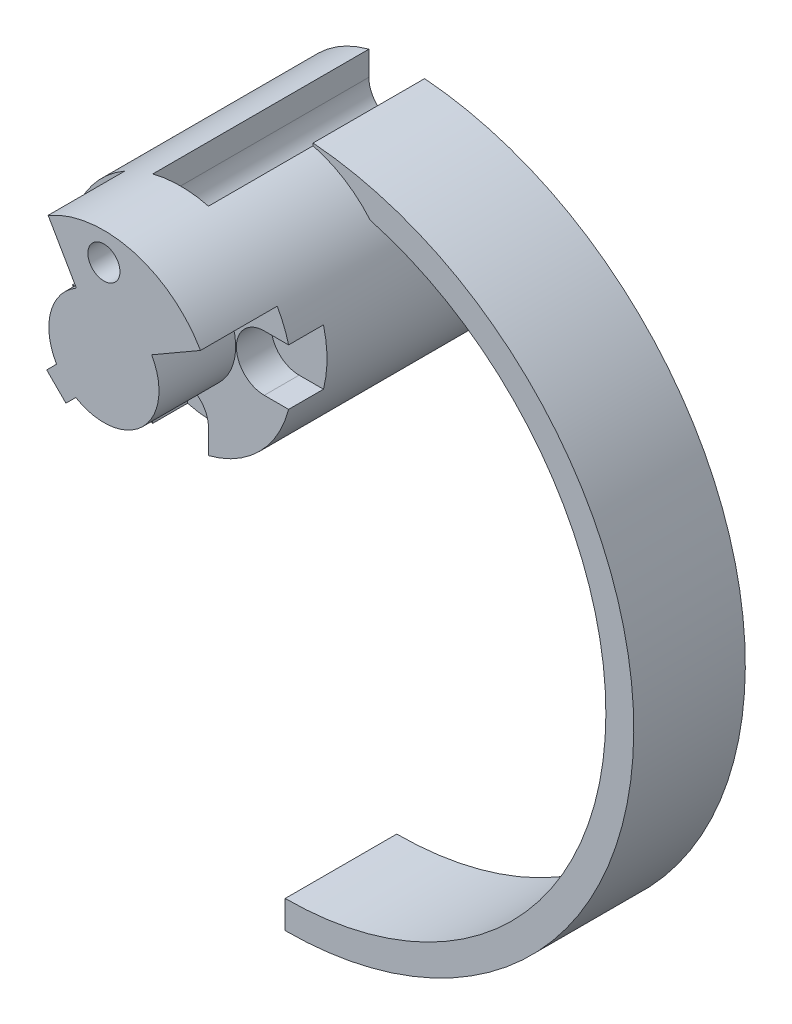
ISO-10303-21;
HEADER;
FILE_DESCRIPTION(('STEP AP214'),'2;1');
FILE_NAME('part.step','',(''),(''),'','','');
FILE_SCHEMA(('AUTOMOTIVE_DESIGN { 1 0 10303 214 1 1 1 1 }'));
ENDSEC;
DATA;
#1=APPLICATION_CONTEXT('core data for automotive mechanical design processes');
#2=APPLICATION_PROTOCOL_DEFINITION('international standard','automotive_design',2000,#1);
#3=PRODUCT_CONTEXT('',#1,'mechanical');
#4=PRODUCT('Part','Part','',(#3));
#5=PRODUCT_RELATED_PRODUCT_CATEGORY('part','',(#4));
#6=PRODUCT_DEFINITION_FORMATION('','',#4);
#7=PRODUCT_DEFINITION_CONTEXT('part definition',#1,'design');
#8=PRODUCT_DEFINITION('design','',#6,#7);
#9=PRODUCT_DEFINITION_SHAPE('','',#8);
#10=(LENGTH_UNIT() NAMED_UNIT(*) SI_UNIT(.MILLI.,.METRE.));
#11=(NAMED_UNIT(*) PLANE_ANGLE_UNIT() SI_UNIT($,.RADIAN.));
#12=(NAMED_UNIT(*) SI_UNIT($,.STERADIAN.) SOLID_ANGLE_UNIT());
#13=UNCERTAINTY_MEASURE_WITH_UNIT(LENGTH_MEASURE(1.E-05),#10,'distance_accuracy_value','');
#14=(GEOMETRIC_REPRESENTATION_CONTEXT(3) GLOBAL_UNCERTAINTY_ASSIGNED_CONTEXT((#13)) GLOBAL_UNIT_ASSIGNED_CONTEXT((#10,
#11,#12)) REPRESENTATION_CONTEXT('',''));
#15=CARTESIAN_POINT('',(0.,0.,0.));
#16=DIRECTION('',(0.,0.,1.));
#17=DIRECTION('',(1.,0.,0.));
#18=AXIS2_PLACEMENT_3D('',#15,#16,#17);
#19=CARTESIAN_POINT('',(0.,-17.,-8.));
#20=DIRECTION('',(0.,0.,1.));
#21=DIRECTION('',(-1.,0.,0.));
#22=AXIS2_PLACEMENT_3D('',#19,#20,#21);
#23=PLANE('',#22);
#24=CARTESIAN_POINT('',(0.,0.,-8.));
#25=DIRECTION('',(0.,0.,1.));
#26=DIRECTION('',(1.,0.,0.));
#27=AXIS2_PLACEMENT_3D('',#24,#25,#26);
#28=CIRCLE('',#27,8.);
#29=CARTESIAN_POINT('',(-2.,7.74596669241485,-8.));
#30=VERTEX_POINT('',#29);
#31=CARTESIAN_POINT('',(6.09952065732505,5.17647058823529,-8.));
#32=VERTEX_POINT('',#31);
#33=EDGE_CURVE('E360',#30,#32,#28,.T.);
#34=ORIENTED_EDGE('',*,*,#33,.F.);
#35=DIRECTION('',(0.,-1.,0.));
#36=VECTOR('',#35,1.);
#37=CARTESIAN_POINT('',(-2.,6.,-8.));
#38=LINE('',#37,#36);
#39=CARTESIAN_POINT('',(-2.,6.,-8.));
#40=VERTEX_POINT('',#39);
#41=EDGE_CURVE('E282',#30,#40,#38,.T.);
#42=ORIENTED_EDGE('',*,*,#41,.T.);
#43=CARTESIAN_POINT('',(0.,6.,-8.));
#44=DIRECTION('',(0.,0.,1.));
#45=DIRECTION('',(-1.,0.,0.));
#46=AXIS2_PLACEMENT_3D('',#43,#44,#45);
#47=CIRCLE('',#46,2.);
#48=CARTESIAN_POINT('',(2.,6.,-8.));
#49=VERTEX_POINT('',#48);
#50=EDGE_CURVE('E289',#40,#49,#47,.T.);
#51=ORIENTED_EDGE('',*,*,#50,.T.);
#52=DIRECTION('',(0.,1.,0.));
#53=VECTOR('',#52,1.);
#54=CARTESIAN_POINT('',(2.,10.,-8.));
#55=LINE('',#54,#53);
#56=CARTESIAN_POINT('',(2.,7.91987158875422,-8.));
#57=VERTEX_POINT('',#56);
#58=EDGE_CURVE('E286',#49,#57,#55,.T.);
#59=ORIENTED_EDGE('',*,*,#58,.T.);
#60=CARTESIAN_POINT('',(0.,-17.,-8.));
#61=DIRECTION('',(0.,0.,1.));
#62=DIRECTION('',(-1.,0.,0.));
#63=AXIS2_PLACEMENT_3D('',#60,#61,#62);
#64=CIRCLE('',#63,25.);
#65=CARTESIAN_POINT('',(0.,-42.,-8.));
#66=VERTEX_POINT('',#65);
#67=EDGE_CURVE('E357',#66,#57,#64,.T.);
#68=ORIENTED_EDGE('',*,*,#67,.F.);
#69=DIRECTION('',(0.,-1.,0.));
#70=VECTOR('',#69,1.);
#71=CARTESIAN_POINT('',(0.,-42.,-8.));
#72=LINE('',#71,#70);
#73=CARTESIAN_POINT('',(0.,-40.,-8.));
#74=VERTEX_POINT('',#73);
#75=EDGE_CURVE('E367',#74,#66,#72,.T.);
#76=ORIENTED_EDGE('',*,*,#75,.F.);
#77=CARTESIAN_POINT('',(0.,-17.,-8.));
#78=DIRECTION('',(0.,0.,-1.));
#79=DIRECTION('',(-1.,0.,0.));
#80=AXIS2_PLACEMENT_3D('',#77,#78,#79);
#81=CIRCLE('',#80,23.);
#82=EDGE_CURVE('E364',#32,#74,#81,.T.);
#83=ORIENTED_EDGE('',*,*,#82,.F.);
#84=EDGE_LOOP('',(#34,#42,#51,#59,#68,#76,#83));
#85=FACE_BOUND('',#84,.T.);
#86=ADVANCED_FACE('F35',(#85),#23,.F.);
#87=CARTESIAN_POINT('',(0.,-17.,0.));
#88=DIRECTION('',(0.,0.,1.));
#89=DIRECTION('',(-1.,0.,0.));
#90=AXIS2_PLACEMENT_3D('',#87,#88,#89);
#91=PLANE('',#90);
#92=DIRECTION('',(0.,-1.,0.));
#93=VECTOR('',#92,1.);
#94=CARTESIAN_POINT('',(2.,-17.,0.));
#95=LINE('',#94,#93);
#96=CARTESIAN_POINT('',(2.,7.91987158875422,0.));
#97=VERTEX_POINT('',#96);
#98=CARTESIAN_POINT('',(2.,7.74596669241484,0.));
#99=VERTEX_POINT('',#98);
#100=EDGE_CURVE('E343',#97,#99,#95,.T.);
#101=ORIENTED_EDGE('',*,*,#100,.T.);
#102=CARTESIAN_POINT('',(0.,0.,0.));
#103=DIRECTION('',(0.,0.,-1.));
#104=DIRECTION('',(-1.,0.,0.));
#105=AXIS2_PLACEMENT_3D('',#102,#103,#104);
#106=CIRCLE('',#105,8.);
#107=CARTESIAN_POINT('',(6.09952065732505,5.17647058823529,0.));
#108=VERTEX_POINT('',#107);
#109=EDGE_CURVE('E351',#99,#108,#106,.T.);
#110=ORIENTED_EDGE('',*,*,#109,.T.);
#111=CARTESIAN_POINT('',(0.,-17.,0.));
#112=DIRECTION('',(0.,0.,-1.));
#113=DIRECTION('',(-1.,0.,0.));
#114=AXIS2_PLACEMENT_3D('',#111,#112,#113);
#115=CIRCLE('',#114,23.);
#116=CARTESIAN_POINT('',(0.,-40.,0.));
#117=VERTEX_POINT('',#116);
#118=EDGE_CURVE('E373',#108,#117,#115,.T.);
#119=ORIENTED_EDGE('',*,*,#118,.T.);
#120=DIRECTION('',(0.,-1.,0.));
#121=VECTOR('',#120,1.);
#122=CARTESIAN_POINT('',(0.,-42.,0.));
#123=LINE('',#122,#121);
#124=CARTESIAN_POINT('',(0.,-42.,0.));
#125=VERTEX_POINT('',#124);
#126=EDGE_CURVE('E361',#117,#125,#123,.T.);
#127=ORIENTED_EDGE('',*,*,#126,.T.);
#128=CARTESIAN_POINT('',(0.,-17.,0.));
#129=DIRECTION('',(0.,0.,1.));
#130=DIRECTION('',(-1.,0.,0.));
#131=AXIS2_PLACEMENT_3D('',#128,#129,#130);
#132=CIRCLE('',#131,25.);
#133=EDGE_CURVE('E354',#125,#97,#132,.T.);
#134=ORIENTED_EDGE('',*,*,#133,.T.);
#135=EDGE_LOOP('',(#101,#110,#119,#127,#134));
#136=FACE_BOUND('',#135,.T.);
#137=ADVANCED_FACE('F415',(#136),#91,.T.);
#138=CARTESIAN_POINT('',(0.,-17.,-8.));
#139=DIRECTION('',(0.,0.,1.));
#140=DIRECTION('',(-1.,0.,0.));
#141=AXIS2_PLACEMENT_3D('',#138,#139,#140);
#142=CYLINDRICAL_SURFACE('',#141,25.);
#143=ORIENTED_EDGE('',*,*,#133,.F.);
#144=DIRECTION('',(0.,0.,1.));
#145=VECTOR('',#144,1.);
#146=CARTESIAN_POINT('',(0.,-42.,-8.));
#147=LINE('',#146,#145);
#148=EDGE_CURVE('E370',#66,#125,#147,.T.);
#149=ORIENTED_EDGE('',*,*,#148,.F.);
#150=ORIENTED_EDGE('',*,*,#67,.T.);
#151=DIRECTION('',(0.,0.,1.));
#152=VECTOR('',#151,1.);
#153=CARTESIAN_POINT('',(2.,7.91987158875422,-8.));
#154=LINE('',#153,#152);
#155=EDGE_CURVE('E346',#97,#57,#154,.F.);
#156=ORIENTED_EDGE('',*,*,#155,.F.);
#157=EDGE_LOOP('',(#143,#149,#150,#156));
#158=FACE_BOUND('',#157,.T.);
#159=ADVANCED_FACE('F37',(#158),#142,.T.);
#160=CARTESIAN_POINT('',(0.,0.,-8.));
#161=DIRECTION('',(0.,0.,1.));
#162=DIRECTION('',(-1.,0.,0.));
#163=AXIS2_PLACEMENT_3D('',#160,#161,#162);
#164=CYLINDRICAL_SURFACE('',#163,8.);
#165=CARTESIAN_POINT('',(0.,0.,5.));
#166=DIRECTION('',(0.,0.,-1.));
#167=DIRECTION('',(-1.,0.,0.));
#168=AXIS2_PLACEMENT_3D('',#165,#166,#167);
#169=CIRCLE('',#168,8.00000000000001);
#170=CARTESIAN_POINT('',(7.74596669241483,-2.,5.));
#171=VERTEX_POINT('',#170);
#172=CARTESIAN_POINT('',(7.74596669241483,2.,5.));
#173=VERTEX_POINT('',#172);
#174=EDGE_CURVE('E561',#171,#173,#169,.F.);
#175=ORIENTED_EDGE('',*,*,#174,.F.);
#176=DIRECTION('',(0.,0.,1.));
#177=VECTOR('',#176,1.);
#178=CARTESIAN_POINT('',(7.74596669241483,-2.,-8.));
#179=LINE('',#178,#177);
#180=CARTESIAN_POINT('',(7.74596669241483,-2.,7.5));
#181=VERTEX_POINT('',#180);
#182=EDGE_CURVE('E387',#181,#171,#179,.F.);
#183=ORIENTED_EDGE('',*,*,#182,.F.);
#184=CARTESIAN_POINT('',(0.,0.,7.5));
#185=DIRECTION('',(0.,0.,-1.));
#186=DIRECTION('',(-1.,0.,0.));
#187=AXIS2_PLACEMENT_3D('',#184,#185,#186);
#188=CIRCLE('',#187,8.);
#189=CARTESIAN_POINT('',(2.,-7.74596669241483,7.5));
#190=VERTEX_POINT('',#189);
#191=EDGE_CURVE('E609',#190,#181,#188,.F.);
#192=ORIENTED_EDGE('',*,*,#191,.F.);
#193=DIRECTION('',(0.,0.,1.));
#194=VECTOR('',#193,1.);
#195=CARTESIAN_POINT('',(2.,-7.74596669241483,-8.));
#196=LINE('',#195,#194);
#197=CARTESIAN_POINT('',(2.,-7.74596669241483,5.));
#198=VERTEX_POINT('',#197);
#199=EDGE_CURVE('E389',#198,#190,#196,.T.);
#200=ORIENTED_EDGE('',*,*,#199,.F.);
#201=CARTESIAN_POINT('',(-2.,-7.74596669241484,5.));
#202=VERTEX_POINT('',#201);
#203=EDGE_CURVE('E559',#202,#198,#169,.F.);
#204=ORIENTED_EDGE('',*,*,#203,.F.);
#205=DIRECTION('',(0.,0.,1.));
#206=VECTOR('',#205,1.);
#207=CARTESIAN_POINT('',(-2.,-7.74596669241484,-8.));
#208=LINE('',#207,#206);
#209=CARTESIAN_POINT('',(-2.,-7.74596669241483,7.5));
#210=VERTEX_POINT('',#209);
#211=EDGE_CURVE('E392',#210,#202,#208,.F.);
#212=ORIENTED_EDGE('',*,*,#211,.F.);
#213=CARTESIAN_POINT('',(-7.74596669241483,-2.,7.5));
#214=VERTEX_POINT('',#213);
#215=EDGE_CURVE('E583',#214,#210,#188,.F.);
#216=ORIENTED_EDGE('',*,*,#215,.F.);
#217=DIRECTION('',(0.,0.,1.));
#218=VECTOR('',#217,1.);
#219=CARTESIAN_POINT('',(-7.74596669241484,-2.,-8.));
#220=LINE('',#219,#218);
#221=CARTESIAN_POINT('',(-7.74596669241484,-2.,5.));
#222=VERTEX_POINT('',#221);
#223=EDGE_CURVE('E395',#222,#214,#220,.T.);
#224=ORIENTED_EDGE('',*,*,#223,.F.);
#225=CARTESIAN_POINT('',(-7.74596669241485,2.,5.));
#226=VERTEX_POINT('',#225);
#227=EDGE_CURVE('E546',#226,#222,#169,.F.);
#228=ORIENTED_EDGE('',*,*,#227,.F.);
#229=DIRECTION('',(0.,0.,1.));
#230=VECTOR('',#229,1.);
#231=CARTESIAN_POINT('',(-7.74596669241485,2.,-8.));
#232=LINE('',#231,#230);
#233=CARTESIAN_POINT('',(-7.74596669241483,2.,7.5));
#234=VERTEX_POINT('',#233);
#235=EDGE_CURVE('E398',#234,#226,#232,.F.);
#236=ORIENTED_EDGE('',*,*,#235,.F.);
#237=CARTESIAN_POINT('',(-4.00000000000001,6.92820323027551,7.5));
#238=VERTEX_POINT('',#237);
#239=EDGE_CURVE('E580',#238,#234,#188,.F.);
#240=ORIENTED_EDGE('',*,*,#239,.F.);
#241=DIRECTION('',(0.,0.,1.));
#242=VECTOR('',#241,1.);
#243=CARTESIAN_POINT('',(-4.00000000000001,6.92820323027551,-14.3826701223687));
#244=LINE('',#243,#242);
#245=CARTESIAN_POINT('',(-4.00000000000001,6.92820323027551,13.));
#246=VERTEX_POINT('',#245);
#247=EDGE_CURVE('E275',#238,#246,#244,.T.);
#248=ORIENTED_EDGE('',*,*,#247,.T.);
#249=CARTESIAN_POINT('',(0.,0.,13.));
#250=DIRECTION('',(0.,0.,-1.));
#251=DIRECTION('',(-1.,0.,0.));
#252=AXIS2_PLACEMENT_3D('',#249,#250,#251);
#253=CIRCLE('',#252,8.);
#254=CARTESIAN_POINT('',(6.92820323027549,4.00000000000003,13.));
#255=VERTEX_POINT('',#254);
#256=EDGE_CURVE('E352',#246,#255,#253,.T.);
#257=ORIENTED_EDGE('',*,*,#256,.T.);
#258=DIRECTION('',(0.,0.,1.));
#259=VECTOR('',#258,1.);
#260=CARTESIAN_POINT('',(6.92820323027549,4.00000000000003,-14.3826701223687));
#261=LINE('',#260,#259);
#262=CARTESIAN_POINT('',(6.92820323027549,4.00000000000003,7.5));
#263=VERTEX_POINT('',#262);
#264=EDGE_CURVE('E232',#263,#255,#261,.T.);
#265=ORIENTED_EDGE('',*,*,#264,.F.);
#266=CARTESIAN_POINT('',(7.74596669241483,2.,7.5));
#267=VERTEX_POINT('',#266);
#268=EDGE_CURVE('E266',#267,#263,#188,.F.);
#269=ORIENTED_EDGE('',*,*,#268,.F.);
#270=DIRECTION('',(0.,0.,1.));
#271=VECTOR('',#270,1.);
#272=CARTESIAN_POINT('',(7.74596669241483,2.,-8.));
#273=LINE('',#272,#271);
#274=EDGE_CURVE('E383',#173,#267,#273,.T.);
#275=ORIENTED_EDGE('',*,*,#274,.F.);
#276=EDGE_LOOP('',(#175,#183,#192,#200,#204,#212,#216,#224,#228,#236,#240,#248,#257,#265,#269,#275));
#277=FACE_BOUND('',#276,.T.);
#278=ORIENTED_EDGE('',*,*,#109,.F.);
#279=DIRECTION('',(0.,0.,1.));
#280=VECTOR('',#279,1.);
#281=CARTESIAN_POINT('',(2.,7.74596669241484,-8.));
#282=LINE('',#281,#280);
#283=CARTESIAN_POINT('',(2.,7.74596669241484,7.5));
#284=VERTEX_POINT('',#283);
#285=EDGE_CURVE('E43',#284,#99,#282,.F.);
#286=ORIENTED_EDGE('',*,*,#285,.F.);
#287=CARTESIAN_POINT('',(0.,0.,7.5));
#288=DIRECTION('',(0.,0.,-1.));
#289=DIRECTION('',(-1.,0.,0.));
#290=AXIS2_PLACEMENT_3D('',#287,#288,#289);
#291=CIRCLE('',#290,8.);
#292=CARTESIAN_POINT('',(-2.,7.74596669241485,7.5));
#293=VERTEX_POINT('',#292);
#294=EDGE_CURVE('E340',#293,#284,#291,.T.);
#295=ORIENTED_EDGE('',*,*,#294,.F.);
#296=DIRECTION('',(0.,0.,1.));
#297=VECTOR('',#296,1.);
#298=CARTESIAN_POINT('',(-2.,7.74596669241485,-8.));
#299=LINE('',#298,#297);
#300=EDGE_CURVE('E401',#30,#293,#299,.T.);
#301=ORIENTED_EDGE('',*,*,#300,.F.);
#302=ORIENTED_EDGE('',*,*,#33,.T.);
#303=DIRECTION('',(0.,0.,1.));
#304=VECTOR('',#303,1.);
#305=CARTESIAN_POINT('',(6.09952065732505,5.17647058823529,-8.));
#306=LINE('',#305,#304);
#307=EDGE_CURVE('E381',#32,#108,#306,.T.);
#308=ORIENTED_EDGE('',*,*,#307,.T.);
#309=EDGE_LOOP('',(#278,#286,#295,#301,#302,#308));
#310=FACE_BOUND('',#309,.T.);
#311=ADVANCED_FACE('F412',(#277,#310),#164,.T.);
#312=CARTESIAN_POINT('',(0.,-17.,-8.));
#313=DIRECTION('',(0.,0.,1.));
#314=DIRECTION('',(-1.,0.,0.));
#315=AXIS2_PLACEMENT_3D('',#312,#313,#314);
#316=CYLINDRICAL_SURFACE('',#315,23.);
#317=ORIENTED_EDGE('',*,*,#118,.F.);
#318=ORIENTED_EDGE('',*,*,#307,.F.);
#319=ORIENTED_EDGE('',*,*,#82,.T.);
#320=DIRECTION('',(0.,0.,1.));
#321=VECTOR('',#320,1.);
#322=CARTESIAN_POINT('',(0.,-40.,-8.));
#323=LINE('',#322,#321);
#324=EDGE_CURVE('E379',#74,#117,#323,.T.);
#325=ORIENTED_EDGE('',*,*,#324,.T.);
#326=EDGE_LOOP('',(#317,#318,#319,#325));
#327=FACE_BOUND('',#326,.T.);
#328=ADVANCED_FACE('F435',(#327),#316,.F.);
#329=CARTESIAN_POINT('',(0.,-42.,-8.));
#330=DIRECTION('',(1.,0.,0.));
#331=DIRECTION('',(0.,0.,1.));
#332=AXIS2_PLACEMENT_3D('',#329,#330,#331);
#333=PLANE('',#332);
#334=ORIENTED_EDGE('',*,*,#126,.F.);
#335=ORIENTED_EDGE('',*,*,#324,.F.);
#336=ORIENTED_EDGE('',*,*,#75,.T.);
#337=ORIENTED_EDGE('',*,*,#148,.T.);
#338=EDGE_LOOP('',(#334,#335,#336,#337));
#339=FACE_BOUND('',#338,.T.);
#340=ADVANCED_FACE('F437',(#339),#333,.F.);
#341=CARTESIAN_POINT('',(0.,6.,-8.));
#342=DIRECTION('',(0.,0.,1.));
#343=DIRECTION('',(-1.,0.,0.));
#344=AXIS2_PLACEMENT_3D('',#341,#342,#343);
#345=CYLINDRICAL_SURFACE('',#344,1.15);
#346=CARTESIAN_POINT('',(0.,6.,7.5));
#347=DIRECTION('',(0.,0.,-1.));
#348=DIRECTION('',(-1.,0.,0.));
#349=AXIS2_PLACEMENT_3D('',#346,#347,#348);
#350=CIRCLE('',#349,1.15);
#351=CARTESIAN_POINT('',(-1.15,6.,7.5));
#352=VERTEX_POINT('',#351);
#353=EDGE_CURVE('E303',#352,#352,#350,.T.);
#354=ORIENTED_EDGE('',*,*,#353,.T.);
#355=EDGE_LOOP('',(#354));
#356=FACE_BOUND('',#355,.T.);
#357=CARTESIAN_POINT('',(0.,6.,13.));
#358=DIRECTION('',(0.,0.,-1.));
#359=DIRECTION('',(-1.,0.,0.));
#360=AXIS2_PLACEMENT_3D('',#357,#358,#359);
#361=CIRCLE('',#360,1.15);
#362=CARTESIAN_POINT('',(-1.15,6.,13.));
#363=VERTEX_POINT('',#362);
#364=EDGE_CURVE('E348',#363,#363,#361,.T.);
#365=ORIENTED_EDGE('',*,*,#364,.F.);
#366=EDGE_LOOP('',(#365));
#367=FACE_BOUND('',#366,.T.);
#368=ADVANCED_FACE('F439',(#356,#367),#345,.F.);
#369=CARTESIAN_POINT('',(0.,0.,13.));
#370=DIRECTION('',(0.,0.,1.));
#371=DIRECTION('',(-1.,0.,0.));
#372=AXIS2_PLACEMENT_3D('',#369,#370,#371);
#373=PLANE('',#372);
#374=DIRECTION('',(0.500000000000001,-0.866025403784438,0.));
#375=VECTOR('',#374,1.);
#376=CARTESIAN_POINT('',(-4.00000000000001,6.92820323027551,13.));
#377=LINE('',#376,#375);
#378=CARTESIAN_POINT('',(-1.975,3.42080034494853,13.));
#379=VERTEX_POINT('',#378);
#380=EDGE_CURVE('E242',#246,#379,#377,.T.);
#381=ORIENTED_EDGE('',*,*,#380,.T.);
#382=CARTESIAN_POINT('',(0.,0.,13.));
#383=DIRECTION('',(0.,0.,1.));
#384=DIRECTION('',(-1.,0.,0.));
#385=AXIS2_PLACEMENT_3D('',#382,#383,#384);
#386=CIRCLE('',#385,3.95);
#387=CARTESIAN_POINT('',(-3.39607602250434,-2.01721779919054,13.));
#388=VERTEX_POINT('',#387);
#389=EDGE_CURVE('E255',#379,#388,#386,.T.);
#390=ORIENTED_EDGE('',*,*,#389,.T.);
#391=DIRECTION('',(-0.707106781186551,-0.707106781186544,0.));
#392=VECTOR('',#391,1.);
#393=CARTESIAN_POINT('',(-4.10318280369089,-2.72432458037708,13.));
#394=LINE('',#393,#392);
#395=CARTESIAN_POINT('',(-4.10318280369089,-2.72432458037708,13.));
#396=VERTEX_POINT('',#395);
#397=EDGE_CURVE('E258',#388,#396,#394,.T.);
#398=ORIENTED_EDGE('',*,*,#397,.T.);
#399=DIRECTION('',(0.707106781186544,-0.707106781186551,0.));
#400=VECTOR('',#399,1.);
#401=CARTESIAN_POINT('',(-2.72432458037713,-4.10318280369086,13.));
#402=LINE('',#401,#400);
#403=CARTESIAN_POINT('',(-2.72432458037713,-4.10318280369086,13.));
#404=VERTEX_POINT('',#403);
#405=EDGE_CURVE('E261',#396,#404,#402,.T.);
#406=ORIENTED_EDGE('',*,*,#405,.T.);
#407=DIRECTION('',(0.707106781186552,0.707106781186543,0.));
#408=VECTOR('',#407,1.);
#409=CARTESIAN_POINT('',(-2.01721779919058,-3.39607602250432,13.));
#410=LINE('',#409,#408);
#411=CARTESIAN_POINT('',(-2.01721779919058,-3.39607602250432,13.));
#412=VERTEX_POINT('',#411);
#413=EDGE_CURVE('E233',#404,#412,#410,.T.);
#414=ORIENTED_EDGE('',*,*,#413,.T.);
#415=CARTESIAN_POINT('',(0.,0.,13.));
#416=DIRECTION('',(0.,0.,1.));
#417=DIRECTION('',(-1.,0.,0.));
#418=AXIS2_PLACEMENT_3D('',#415,#416,#417);
#419=CIRCLE('',#418,3.95);
#420=CARTESIAN_POINT('',(3.42080034494852,1.97500000000002,13.));
#421=VERTEX_POINT('',#420);
#422=EDGE_CURVE('E226',#412,#421,#419,.T.);
#423=ORIENTED_EDGE('',*,*,#422,.T.);
#424=DIRECTION('',(0.866025403784436,0.500000000000004,0.));
#425=VECTOR('',#424,1.);
#426=CARTESIAN_POINT('',(3.42080034494852,1.97500000000002,13.));
#427=LINE('',#426,#425);
#428=EDGE_CURVE('E236',#421,#255,#427,.T.);
#429=ORIENTED_EDGE('',*,*,#428,.T.);
#430=ORIENTED_EDGE('',*,*,#256,.F.);
#431=EDGE_LOOP('',(#381,#390,#398,#406,#414,#423,#429,#430));
#432=FACE_BOUND('',#431,.T.);
#433=ORIENTED_EDGE('',*,*,#364,.T.);
#434=EDGE_LOOP('',(#433));
#435=FACE_BOUND('',#434,.T.);
#436=ADVANCED_FACE('F245',(#432,#435),#373,.T.);
#437=CARTESIAN_POINT('',(10.,-2.,20.211102550928));
#438=DIRECTION('',(0.,-1.,0.));
#439=DIRECTION('',(1.,0.,0.));
#440=AXIS2_PLACEMENT_3D('',#437,#438,#439);
#441=PLANE('',#440);
#442=DIRECTION('',(0.,0.,-1.));
#443=VECTOR('',#442,1.);
#444=CARTESIAN_POINT('',(6.,-2.,20.211102550928));
#445=LINE('',#444,#443);
#446=CARTESIAN_POINT('',(6.,-2.,7.5));
#447=VERTEX_POINT('',#446);
#448=CARTESIAN_POINT('',(6.,-2.,5.));
#449=VERTEX_POINT('',#448);
#450=EDGE_CURVE('E320',#447,#449,#445,.T.);
#451=ORIENTED_EDGE('',*,*,#450,.F.);
#452=DIRECTION('',(1.,0.,0.));
#453=VECTOR('',#452,1.);
#454=CARTESIAN_POINT('',(10.,-2.,7.5));
#455=LINE('',#454,#453);
#456=EDGE_CURVE('E281',#447,#181,#455,.T.);
#457=ORIENTED_EDGE('',*,*,#456,.T.);
#458=ORIENTED_EDGE('',*,*,#182,.T.);
#459=DIRECTION('',(1.,0.,0.));
#460=VECTOR('',#459,1.);
#461=CARTESIAN_POINT('',(10.,-2.,5.));
#462=LINE('',#461,#460);
#463=EDGE_CURVE('E50',#449,#171,#462,.T.);
#464=ORIENTED_EDGE('',*,*,#463,.F.);
#465=EDGE_LOOP('',(#451,#457,#458,#464));
#466=FACE_BOUND('',#465,.T.);
#467=ADVANCED_FACE('F457',(#466),#441,.F.);
#468=CARTESIAN_POINT('',(6.,2.,20.211102550928));
#469=DIRECTION('',(0.,1.,0.));
#470=DIRECTION('',(-1.,0.,0.));
#471=AXIS2_PLACEMENT_3D('',#468,#469,#470);
#472=PLANE('',#471);
#473=ORIENTED_EDGE('',*,*,#274,.T.);
#474=DIRECTION('',(-1.,0.,0.));
#475=VECTOR('',#474,1.);
#476=CARTESIAN_POINT('',(6.,2.,7.5));
#477=LINE('',#476,#475);
#478=CARTESIAN_POINT('',(6.,2.,7.5));
#479=VERTEX_POINT('',#478);
#480=EDGE_CURVE('E331',#267,#479,#477,.T.);
#481=ORIENTED_EDGE('',*,*,#480,.T.);
#482=DIRECTION('',(0.,0.,-1.));
#483=VECTOR('',#482,1.);
#484=CARTESIAN_POINT('',(6.,2.,20.211102550928));
#485=LINE('',#484,#483);
#486=CARTESIAN_POINT('',(6.,2.,5.));
#487=VERTEX_POINT('',#486);
#488=EDGE_CURVE('E334',#479,#487,#485,.T.);
#489=ORIENTED_EDGE('',*,*,#488,.T.);
#490=DIRECTION('',(-1.,0.,0.));
#491=VECTOR('',#490,1.);
#492=CARTESIAN_POINT('',(6.,2.,5.));
#493=LINE('',#492,#491);
#494=EDGE_CURVE('E58',#173,#487,#493,.T.);
#495=ORIENTED_EDGE('',*,*,#494,.F.);
#496=EDGE_LOOP('',(#473,#481,#489,#495));
#497=FACE_BOUND('',#496,.T.);
#498=ADVANCED_FACE('F460',(#497),#472,.F.);
#499=CARTESIAN_POINT('',(6.,0.,20.211102550928));
#500=DIRECTION('',(0.,0.,-1.));
#501=DIRECTION('',(1.,0.,0.));
#502=AXIS2_PLACEMENT_3D('',#499,#500,#501);
#503=CYLINDRICAL_SURFACE('',#502,2.);
#504=ORIENTED_EDGE('',*,*,#488,.F.);
#505=CARTESIAN_POINT('',(6.,0.,7.5));
#506=DIRECTION('',(0.,0.,-1.));
#507=DIRECTION('',(-1.,0.,0.));
#508=AXIS2_PLACEMENT_3D('',#505,#506,#507);
#509=CIRCLE('',#508,2.);
#510=EDGE_CURVE('E332',#479,#447,#509,.F.);
#511=ORIENTED_EDGE('',*,*,#510,.T.);
#512=ORIENTED_EDGE('',*,*,#450,.T.);
#513=CARTESIAN_POINT('',(6.,0.,5.));
#514=DIRECTION('',(0.,0.,-1.));
#515=DIRECTION('',(-1.,0.,0.));
#516=AXIS2_PLACEMENT_3D('',#513,#514,#515);
#517=CIRCLE('',#516,2.);
#518=EDGE_CURVE('E572',#487,#449,#517,.F.);
#519=ORIENTED_EDGE('',*,*,#518,.F.);
#520=EDGE_LOOP('',(#504,#511,#512,#519));
#521=FACE_BOUND('',#520,.T.);
#522=ADVANCED_FACE('F464',(#521),#503,.F.);
#523=CARTESIAN_POINT('',(-2.,-10.,20.211102550928));
#524=DIRECTION('',(-1.,0.,0.));
#525=DIRECTION('',(0.,-1.,0.));
#526=AXIS2_PLACEMENT_3D('',#523,#524,#525);
#527=PLANE('',#526);
#528=DIRECTION('',(0.,0.,-1.));
#529=VECTOR('',#528,1.);
#530=CARTESIAN_POINT('',(-2.,-6.,20.211102550928));
#531=LINE('',#530,#529);
#532=CARTESIAN_POINT('',(-2.,-6.,7.5));
#533=VERTEX_POINT('',#532);
#534=CARTESIAN_POINT('',(-2.,-6.,5.));
#535=VERTEX_POINT('',#534);
#536=EDGE_CURVE('E307',#533,#535,#531,.T.);
#537=ORIENTED_EDGE('',*,*,#536,.F.);
#538=DIRECTION('',(0.,-1.,0.));
#539=VECTOR('',#538,1.);
#540=CARTESIAN_POINT('',(-2.,-10.,7.5));
#541=LINE('',#540,#539);
#542=EDGE_CURVE('E317',#533,#210,#541,.T.);
#543=ORIENTED_EDGE('',*,*,#542,.T.);
#544=ORIENTED_EDGE('',*,*,#211,.T.);
#545=DIRECTION('',(0.,-1.,0.));
#546=VECTOR('',#545,1.);
#547=CARTESIAN_POINT('',(-2.,-10.,5.));
#548=LINE('',#547,#546);
#549=EDGE_CURVE('E573',#535,#202,#548,.T.);
#550=ORIENTED_EDGE('',*,*,#549,.F.);
#551=EDGE_LOOP('',(#537,#543,#544,#550));
#552=FACE_BOUND('',#551,.T.);
#553=ADVANCED_FACE('F467',(#552),#527,.F.);
#554=CARTESIAN_POINT('',(2.,-6.,20.211102550928));
#555=DIRECTION('',(1.,0.,0.));
#556=DIRECTION('',(0.,1.,0.));
#557=AXIS2_PLACEMENT_3D('',#554,#555,#556);
#558=PLANE('',#557);
#559=ORIENTED_EDGE('',*,*,#199,.T.);
#560=DIRECTION('',(0.,1.,0.));
#561=VECTOR('',#560,1.);
#562=CARTESIAN_POINT('',(2.,-6.,7.5));
#563=LINE('',#562,#561);
#564=CARTESIAN_POINT('',(2.,-6.,7.5));
#565=VERTEX_POINT('',#564);
#566=EDGE_CURVE('E319',#190,#565,#563,.T.);
#567=ORIENTED_EDGE('',*,*,#566,.T.);
#568=DIRECTION('',(0.,0.,-1.));
#569=VECTOR('',#568,1.);
#570=CARTESIAN_POINT('',(2.,-6.,20.211102550928));
#571=LINE('',#570,#569);
#572=CARTESIAN_POINT('',(2.,-6.,5.));
#573=VERTEX_POINT('',#572);
#574=EDGE_CURVE('E323',#565,#573,#571,.T.);
#575=ORIENTED_EDGE('',*,*,#574,.T.);
#576=DIRECTION('',(0.,1.,0.));
#577=VECTOR('',#576,1.);
#578=CARTESIAN_POINT('',(2.,-6.,5.));
#579=LINE('',#578,#577);
#580=EDGE_CURVE('E576',#198,#573,#579,.T.);
#581=ORIENTED_EDGE('',*,*,#580,.F.);
#582=EDGE_LOOP('',(#559,#567,#575,#581));
#583=FACE_BOUND('',#582,.T.);
#584=ADVANCED_FACE('F471',(#583),#558,.F.);
#585=CARTESIAN_POINT('',(0.,-6.,20.211102550928));
#586=DIRECTION('',(0.,0.,-1.));
#587=DIRECTION('',(1.,0.,0.));
#588=AXIS2_PLACEMENT_3D('',#585,#586,#587);
#589=CYLINDRICAL_SURFACE('',#588,2.);
#590=ORIENTED_EDGE('',*,*,#574,.F.);
#591=CARTESIAN_POINT('',(0.,-6.,7.5));
#592=DIRECTION('',(0.,0.,-1.));
#593=DIRECTION('',(-1.,0.,0.));
#594=AXIS2_PLACEMENT_3D('',#591,#592,#593);
#595=CIRCLE('',#594,2.);
#596=EDGE_CURVE('E321',#565,#533,#595,.F.);
#597=ORIENTED_EDGE('',*,*,#596,.T.);
#598=ORIENTED_EDGE('',*,*,#536,.T.);
#599=CARTESIAN_POINT('',(0.,-6.,5.));
#600=DIRECTION('',(0.,0.,-1.));
#601=DIRECTION('',(-1.,0.,0.));
#602=AXIS2_PLACEMENT_3D('',#599,#600,#601);
#603=CIRCLE('',#602,2.);
#604=EDGE_CURVE('E549',#573,#535,#603,.F.);
#605=ORIENTED_EDGE('',*,*,#604,.F.);
#606=EDGE_LOOP('',(#590,#597,#598,#605));
#607=FACE_BOUND('',#606,.T.);
#608=ADVANCED_FACE('F475',(#607),#589,.F.);
#609=CARTESIAN_POINT('',(-10.,2.,20.211102550928));
#610=DIRECTION('',(0.,1.,0.));
#611=DIRECTION('',(-1.,0.,0.));
#612=AXIS2_PLACEMENT_3D('',#609,#610,#611);
#613=PLANE('',#612);
#614=DIRECTION('',(0.,0.,-1.));
#615=VECTOR('',#614,1.);
#616=CARTESIAN_POINT('',(-6.,2.,20.211102550928));
#617=LINE('',#616,#615);
#618=CARTESIAN_POINT('',(-6.,2.,7.5));
#619=VERTEX_POINT('',#618);
#620=CARTESIAN_POINT('',(-6.,2.,5.));
#621=VERTEX_POINT('',#620);
#622=EDGE_CURVE('E292',#619,#621,#617,.T.);
#623=ORIENTED_EDGE('',*,*,#622,.F.);
#624=DIRECTION('',(-1.,0.,0.));
#625=VECTOR('',#624,1.);
#626=CARTESIAN_POINT('',(-10.,2.,7.5));
#627=LINE('',#626,#625);
#628=EDGE_CURVE('E304',#619,#234,#627,.T.);
#629=ORIENTED_EDGE('',*,*,#628,.T.);
#630=ORIENTED_EDGE('',*,*,#235,.T.);
#631=DIRECTION('',(-1.,0.,0.));
#632=VECTOR('',#631,1.);
#633=CARTESIAN_POINT('',(-10.,2.,5.));
#634=LINE('',#633,#632);
#635=EDGE_CURVE('E543',#621,#226,#634,.T.);
#636=ORIENTED_EDGE('',*,*,#635,.F.);
#637=EDGE_LOOP('',(#623,#629,#630,#636));
#638=FACE_BOUND('',#637,.T.);
#639=ADVANCED_FACE('F479',(#638),#613,.F.);
#640=CARTESIAN_POINT('',(-6.,-2.,20.211102550928));
#641=DIRECTION('',(0.,-1.,0.));
#642=DIRECTION('',(1.,0.,0.));
#643=AXIS2_PLACEMENT_3D('',#640,#641,#642);
#644=PLANE('',#643);
#645=ORIENTED_EDGE('',*,*,#223,.T.);
#646=DIRECTION('',(1.,0.,0.));
#647=VECTOR('',#646,1.);
#648=CARTESIAN_POINT('',(-6.,-2.,7.5));
#649=LINE('',#648,#647);
#650=CARTESIAN_POINT('',(-6.,-2.,7.5));
#651=VERTEX_POINT('',#650);
#652=EDGE_CURVE('E306',#214,#651,#649,.T.);
#653=ORIENTED_EDGE('',*,*,#652,.T.);
#654=DIRECTION('',(0.,0.,-1.));
#655=VECTOR('',#654,1.);
#656=CARTESIAN_POINT('',(-6.,-2.,20.211102550928));
#657=LINE('',#656,#655);
#658=CARTESIAN_POINT('',(-6.,-2.,5.));
#659=VERTEX_POINT('',#658);
#660=EDGE_CURVE('E310',#651,#659,#657,.T.);
#661=ORIENTED_EDGE('',*,*,#660,.T.);
#662=DIRECTION('',(1.,0.,0.));
#663=VECTOR('',#662,1.);
#664=CARTESIAN_POINT('',(-6.,-2.,5.));
#665=LINE('',#664,#663);
#666=EDGE_CURVE('E550',#222,#659,#665,.T.);
#667=ORIENTED_EDGE('',*,*,#666,.F.);
#668=EDGE_LOOP('',(#645,#653,#661,#667));
#669=FACE_BOUND('',#668,.T.);
#670=ADVANCED_FACE('F483',(#669),#644,.F.);
#671=CARTESIAN_POINT('',(-6.,0.,20.211102550928));
#672=DIRECTION('',(0.,0.,-1.));
#673=DIRECTION('',(1.,0.,0.));
#674=AXIS2_PLACEMENT_3D('',#671,#672,#673);
#675=CYLINDRICAL_SURFACE('',#674,2.);
#676=ORIENTED_EDGE('',*,*,#660,.F.);
#677=CARTESIAN_POINT('',(-6.,0.,7.5));
#678=DIRECTION('',(0.,0.,-1.));
#679=DIRECTION('',(-1.,0.,0.));
#680=AXIS2_PLACEMENT_3D('',#677,#678,#679);
#681=CIRCLE('',#680,2.);
#682=EDGE_CURVE('E308',#651,#619,#681,.F.);
#683=ORIENTED_EDGE('',*,*,#682,.T.);
#684=ORIENTED_EDGE('',*,*,#622,.T.);
#685=CARTESIAN_POINT('',(-6.,0.,5.));
#686=DIRECTION('',(0.,0.,-1.));
#687=DIRECTION('',(-1.,0.,0.));
#688=AXIS2_PLACEMENT_3D('',#685,#686,#687);
#689=CIRCLE('',#688,2.);
#690=EDGE_CURVE('E12',#659,#621,#689,.F.);
#691=ORIENTED_EDGE('',*,*,#690,.F.);
#692=EDGE_LOOP('',(#676,#683,#684,#691));
#693=FACE_BOUND('',#692,.T.);
#694=ADVANCED_FACE('F487',(#693),#675,.F.);
#695=CARTESIAN_POINT('',(2.,10.,20.211102550928));
#696=DIRECTION('',(1.,0.,0.));
#697=DIRECTION('',(0.,0.,1.));
#698=AXIS2_PLACEMENT_3D('',#695,#696,#697);
#699=PLANE('',#698);
#700=ORIENTED_EDGE('',*,*,#100,.F.);
#701=ORIENTED_EDGE('',*,*,#155,.T.);
#702=ORIENTED_EDGE('',*,*,#58,.F.);
#703=DIRECTION('',(0.,0.,-1.));
#704=VECTOR('',#703,1.);
#705=CARTESIAN_POINT('',(2.,6.,20.211102550928));
#706=LINE('',#705,#704);
#707=CARTESIAN_POINT('',(2.,6.,7.5));
#708=VERTEX_POINT('',#707);
#709=EDGE_CURVE('E297',#708,#49,#706,.T.);
#710=ORIENTED_EDGE('',*,*,#709,.F.);
#711=DIRECTION('',(0.,1.,0.));
#712=VECTOR('',#711,1.);
#713=CARTESIAN_POINT('',(2.,10.,7.5));
#714=LINE('',#713,#712);
#715=EDGE_CURVE('E285',#708,#284,#714,.T.);
#716=ORIENTED_EDGE('',*,*,#715,.T.);
#717=ORIENTED_EDGE('',*,*,#285,.T.);
#718=EDGE_LOOP('',(#700,#701,#702,#710,#716,#717));
#719=FACE_BOUND('',#718,.T.);
#720=ADVANCED_FACE('F407',(#719),#699,.F.);
#721=CARTESIAN_POINT('',(-2.,6.,20.211102550928));
#722=DIRECTION('',(-1.,0.,0.));
#723=DIRECTION('',(0.,0.,-1.));
#724=AXIS2_PLACEMENT_3D('',#721,#722,#723);
#725=PLANE('',#724);
#726=ORIENTED_EDGE('',*,*,#41,.F.);
#727=ORIENTED_EDGE('',*,*,#300,.T.);
#728=DIRECTION('',(0.,-1.,0.));
#729=VECTOR('',#728,1.);
#730=CARTESIAN_POINT('',(-2.,6.,7.5));
#731=LINE('',#730,#729);
#732=CARTESIAN_POINT('',(-2.,6.,7.5));
#733=VERTEX_POINT('',#732);
#734=EDGE_CURVE('E294',#293,#733,#731,.T.);
#735=ORIENTED_EDGE('',*,*,#734,.T.);
#736=DIRECTION('',(0.,0.,-1.));
#737=VECTOR('',#736,1.);
#738=CARTESIAN_POINT('',(-2.,6.,20.211102550928));
#739=LINE('',#738,#737);
#740=EDGE_CURVE('E298',#733,#40,#739,.T.);
#741=ORIENTED_EDGE('',*,*,#740,.T.);
#742=EDGE_LOOP('',(#726,#727,#735,#741));
#743=FACE_BOUND('',#742,.T.);
#744=ADVANCED_FACE('F431',(#743),#725,.F.);
#745=CARTESIAN_POINT('',(0.,0.,7.5));
#746=DIRECTION('',(0.,0.,1.));
#747=DIRECTION('',(-1.,0.,0.));
#748=AXIS2_PLACEMENT_3D('',#745,#746,#747);
#749=PLANE('',#748);
#750=ORIENTED_EDGE('',*,*,#353,.F.);
#751=EDGE_LOOP('',(#750));
#752=FACE_BOUND('',#751,.T.);
#753=ORIENTED_EDGE('',*,*,#734,.F.);
#754=ORIENTED_EDGE('',*,*,#294,.T.);
#755=ORIENTED_EDGE('',*,*,#715,.F.);
#756=CARTESIAN_POINT('',(0.,6.,7.5));
#757=DIRECTION('',(0.,0.,-1.));
#758=DIRECTION('',(-1.,0.,0.));
#759=AXIS2_PLACEMENT_3D('',#756,#757,#758);
#760=CIRCLE('',#759,2.);
#761=EDGE_CURVE('E295',#733,#708,#760,.F.);
#762=ORIENTED_EDGE('',*,*,#761,.F.);
#763=EDGE_LOOP('',(#753,#754,#755,#762));
#764=FACE_BOUND('',#763,.T.);
#765=ADVANCED_FACE('F429',(#752,#764),#749,.F.);
#766=CARTESIAN_POINT('',(0.,6.,20.211102550928));
#767=DIRECTION('',(0.,0.,-1.));
#768=DIRECTION('',(1.,0.,0.));
#769=AXIS2_PLACEMENT_3D('',#766,#767,#768);
#770=CYLINDRICAL_SURFACE('',#769,2.);
#771=ORIENTED_EDGE('',*,*,#740,.F.);
#772=ORIENTED_EDGE('',*,*,#761,.T.);
#773=ORIENTED_EDGE('',*,*,#709,.T.);
#774=ORIENTED_EDGE('',*,*,#50,.F.);
#775=EDGE_LOOP('',(#771,#772,#773,#774));
#776=FACE_BOUND('',#775,.T.);
#777=ADVANCED_FACE('F427',(#776),#770,.F.);
#778=CARTESIAN_POINT('',(0.,0.,7.5));
#779=DIRECTION('',(0.,0.,1.));
#780=DIRECTION('',(-1.,0.,0.));
#781=AXIS2_PLACEMENT_3D('',#778,#779,#780);
#782=PLANE('',#781);
#783=ORIENTED_EDGE('',*,*,#456,.F.);
#784=ORIENTED_EDGE('',*,*,#510,.F.);
#785=ORIENTED_EDGE('',*,*,#480,.F.);
#786=ORIENTED_EDGE('',*,*,#268,.T.);
#787=DIRECTION('',(-0.866025403784436,-0.500000000000004,0.));
#788=VECTOR('',#787,1.);
#789=CARTESIAN_POINT('',(3.42080034494852,1.97500000000002,7.5));
#790=LINE('',#789,#788);
#791=CARTESIAN_POINT('',(3.42080034494852,1.97500000000002,7.5));
#792=VERTEX_POINT('',#791);
#793=EDGE_CURVE('E279',#263,#792,#790,.T.);
#794=ORIENTED_EDGE('',*,*,#793,.T.);
#795=CARTESIAN_POINT('',(0.,0.,7.5));
#796=DIRECTION('',(0.,0.,-1.));
#797=DIRECTION('',(-1.,0.,0.));
#798=AXIS2_PLACEMENT_3D('',#795,#796,#797);
#799=CIRCLE('',#798,3.95);
#800=CARTESIAN_POINT('',(-2.01721779919058,-3.39607602250432,7.5));
#801=VERTEX_POINT('',#800);
#802=EDGE_CURVE('E229',#792,#801,#799,.T.);
#803=ORIENTED_EDGE('',*,*,#802,.T.);
#804=DIRECTION('',(-0.707106781186552,-0.707106781186543,0.));
#805=VECTOR('',#804,1.);
#806=CARTESIAN_POINT('',(-2.01721779919058,-3.39607602250432,7.5));
#807=LINE('',#806,#805);
#808=CARTESIAN_POINT('',(-2.72432458037713,-4.10318280369086,7.5));
#809=VERTEX_POINT('',#808);
#810=EDGE_CURVE('E593',#801,#809,#807,.T.);
#811=ORIENTED_EDGE('',*,*,#810,.T.);
#812=DIRECTION('',(-0.707106781186544,0.707106781186551,0.));
#813=VECTOR('',#812,1.);
#814=CARTESIAN_POINT('',(-2.72432458037713,-4.10318280369086,7.5));
#815=LINE('',#814,#813);
#816=CARTESIAN_POINT('',(-4.10318280369089,-2.72432458037708,7.5));
#817=VERTEX_POINT('',#816);
#818=EDGE_CURVE('E591',#809,#817,#815,.T.);
#819=ORIENTED_EDGE('',*,*,#818,.T.);
#820=DIRECTION('',(0.707106781186551,0.707106781186544,0.));
#821=VECTOR('',#820,1.);
#822=CARTESIAN_POINT('',(-4.10318280369089,-2.72432458037708,7.5));
#823=LINE('',#822,#821);
#824=CARTESIAN_POINT('',(-3.39607602250434,-2.01721779919054,7.5));
#825=VERTEX_POINT('',#824);
#826=EDGE_CURVE('E588',#817,#825,#823,.T.);
#827=ORIENTED_EDGE('',*,*,#826,.T.);
#828=CARTESIAN_POINT('',(0.,0.,7.5));
#829=DIRECTION('',(0.,0.,-1.));
#830=DIRECTION('',(-1.,0.,0.));
#831=AXIS2_PLACEMENT_3D('',#828,#829,#830);
#832=CIRCLE('',#831,3.95);
#833=CARTESIAN_POINT('',(-1.975,3.42080034494853,7.5));
#834=VERTEX_POINT('',#833);
#835=EDGE_CURVE('E585',#825,#834,#832,.T.);
#836=ORIENTED_EDGE('',*,*,#835,.T.);
#837=DIRECTION('',(-0.500000000000001,0.866025403784438,0.));
#838=VECTOR('',#837,1.);
#839=CARTESIAN_POINT('',(-4.00000000000001,6.92820323027551,7.5));
#840=LINE('',#839,#838);
#841=EDGE_CURVE('E582',#834,#238,#840,.T.);
#842=ORIENTED_EDGE('',*,*,#841,.T.);
#843=ORIENTED_EDGE('',*,*,#239,.T.);
#844=ORIENTED_EDGE('',*,*,#628,.F.);
#845=ORIENTED_EDGE('',*,*,#682,.F.);
#846=ORIENTED_EDGE('',*,*,#652,.F.);
#847=ORIENTED_EDGE('',*,*,#215,.T.);
#848=ORIENTED_EDGE('',*,*,#542,.F.);
#849=ORIENTED_EDGE('',*,*,#596,.F.);
#850=ORIENTED_EDGE('',*,*,#566,.F.);
#851=ORIENTED_EDGE('',*,*,#191,.T.);
#852=EDGE_LOOP('',(#783,#784,#785,#786,#794,#803,#811,#819,#827,#836,#842,#843,#844,#845,#846,
#847,#848,#849,#850,#851));
#853=FACE_BOUND('',#852,.T.);
#854=ADVANCED_FACE('F501',(#853),#782,.T.);
#855=CARTESIAN_POINT('',(0.,0.,-14.3826701223687));
#856=DIRECTION('',(0.,0.,1.));
#857=DIRECTION('',(-1.,0.,0.));
#858=AXIS2_PLACEMENT_3D('',#855,#856,#857);
#859=CYLINDRICAL_SURFACE('',#858,3.95);
#860=ORIENTED_EDGE('',*,*,#802,.F.);
#861=DIRECTION('',(0.,0.,1.));
#862=VECTOR('',#861,1.);
#863=CARTESIAN_POINT('',(3.42080034494852,1.97500000000002,-14.3826701223687));
#864=LINE('',#863,#862);
#865=EDGE_CURVE('E222',#792,#421,#864,.T.);
#866=ORIENTED_EDGE('',*,*,#865,.T.);
#867=ORIENTED_EDGE('',*,*,#422,.F.);
#868=DIRECTION('',(0.,0.,1.));
#869=VECTOR('',#868,1.);
#870=CARTESIAN_POINT('',(-2.01721779919058,-3.39607602250432,-14.3826701223687));
#871=LINE('',#870,#869);
#872=EDGE_CURVE('E264',#801,#412,#871,.T.);
#873=ORIENTED_EDGE('',*,*,#872,.F.);
#874=EDGE_LOOP('',(#860,#866,#867,#873));
#875=FACE_BOUND('',#874,.T.);
#876=ADVANCED_FACE('F224',(#875),#859,.T.);
#877=CARTESIAN_POINT('',(-2.01721779919058,-3.39607602250432,-14.3826701223687));
#878=DIRECTION('',(-0.707106781186543,0.707106781186552,0.));
#879=DIRECTION('',(-0.707106781186552,-0.707106781186543,0.));
#880=AXIS2_PLACEMENT_3D('',#877,#878,#879);
#881=PLANE('',#880);
#882=ORIENTED_EDGE('',*,*,#810,.F.);
#883=ORIENTED_EDGE('',*,*,#872,.T.);
#884=ORIENTED_EDGE('',*,*,#413,.F.);
#885=DIRECTION('',(0.,0.,1.));
#886=VECTOR('',#885,1.);
#887=CARTESIAN_POINT('',(-2.72432458037713,-4.10318280369086,-14.3826701223687));
#888=LINE('',#887,#886);
#889=EDGE_CURVE('E267',#809,#404,#888,.T.);
#890=ORIENTED_EDGE('',*,*,#889,.F.);
#891=EDGE_LOOP('',(#882,#883,#884,#890));
#892=FACE_BOUND('',#891,.T.);
#893=ADVANCED_FACE('F504',(#892),#881,.F.);
#894=CARTESIAN_POINT('',(-2.72432458037713,-4.10318280369086,-14.3826701223687));
#895=DIRECTION('',(0.707106781186551,0.707106781186544,0.));
#896=DIRECTION('',(-0.707106781186544,0.707106781186551,0.));
#897=AXIS2_PLACEMENT_3D('',#894,#895,#896);
#898=PLANE('',#897);
#899=ORIENTED_EDGE('',*,*,#818,.F.);
#900=ORIENTED_EDGE('',*,*,#889,.T.);
#901=ORIENTED_EDGE('',*,*,#405,.F.);
#902=DIRECTION('',(0.,0.,1.));
#903=VECTOR('',#902,1.);
#904=CARTESIAN_POINT('',(-4.10318280369089,-2.72432458037708,-14.3826701223687));
#905=LINE('',#904,#903);
#906=EDGE_CURVE('E269',#817,#396,#905,.T.);
#907=ORIENTED_EDGE('',*,*,#906,.F.);
#908=EDGE_LOOP('',(#899,#900,#901,#907));
#909=FACE_BOUND('',#908,.T.);
#910=ADVANCED_FACE('F519',(#909),#898,.F.);
#911=CARTESIAN_POINT('',(-4.10318280369089,-2.72432458037708,-14.3826701223687));
#912=DIRECTION('',(0.707106781186544,-0.707106781186551,0.));
#913=DIRECTION('',(0.707106781186551,0.707106781186544,0.));
#914=AXIS2_PLACEMENT_3D('',#911,#912,#913);
#915=PLANE('',#914);
#916=ORIENTED_EDGE('',*,*,#826,.F.);
#917=ORIENTED_EDGE('',*,*,#906,.T.);
#918=ORIENTED_EDGE('',*,*,#397,.F.);
#919=DIRECTION('',(0.,0.,1.));
#920=VECTOR('',#919,1.);
#921=CARTESIAN_POINT('',(-3.39607602250434,-2.01721779919054,-14.3826701223687));
#922=LINE('',#921,#920);
#923=EDGE_CURVE('E271',#825,#388,#922,.T.);
#924=ORIENTED_EDGE('',*,*,#923,.F.);
#925=EDGE_LOOP('',(#916,#917,#918,#924));
#926=FACE_BOUND('',#925,.T.);
#927=ADVANCED_FACE('F515',(#926),#915,.F.);
#928=CARTESIAN_POINT('',(0.,0.,-14.3826701223687));
#929=DIRECTION('',(0.,0.,1.));
#930=DIRECTION('',(-1.,0.,0.));
#931=AXIS2_PLACEMENT_3D('',#928,#929,#930);
#932=CYLINDRICAL_SURFACE('',#931,3.95);
#933=ORIENTED_EDGE('',*,*,#835,.F.);
#934=ORIENTED_EDGE('',*,*,#923,.T.);
#935=ORIENTED_EDGE('',*,*,#389,.F.);
#936=DIRECTION('',(0.,0.,1.));
#937=VECTOR('',#936,1.);
#938=CARTESIAN_POINT('',(-1.975,3.42080034494853,-14.3826701223687));
#939=LINE('',#938,#937);
#940=EDGE_CURVE('E273',#834,#379,#939,.T.);
#941=ORIENTED_EDGE('',*,*,#940,.F.);
#942=EDGE_LOOP('',(#933,#934,#935,#941));
#943=FACE_BOUND('',#942,.T.);
#944=ADVANCED_FACE('F511',(#943),#932,.T.);
#945=CARTESIAN_POINT('',(-4.00000000000001,6.92820323027551,-14.3826701223687));
#946=DIRECTION('',(0.866025403784438,0.500000000000001,0.));
#947=DIRECTION('',(-0.500000000000001,0.866025403784438,0.));
#948=AXIS2_PLACEMENT_3D('',#945,#946,#947);
#949=PLANE('',#948);
#950=ORIENTED_EDGE('',*,*,#841,.F.);
#951=ORIENTED_EDGE('',*,*,#940,.T.);
#952=ORIENTED_EDGE('',*,*,#380,.F.);
#953=ORIENTED_EDGE('',*,*,#247,.F.);
#954=EDGE_LOOP('',(#950,#951,#952,#953));
#955=FACE_BOUND('',#954,.T.);
#956=ADVANCED_FACE('F508',(#955),#949,.F.);
#957=CARTESIAN_POINT('',(3.42080034494852,1.97500000000002,-14.3826701223687));
#958=DIRECTION('',(-0.500000000000004,0.866025403784436,0.));
#959=DIRECTION('',(-0.866025403784436,-0.500000000000004,0.));
#960=AXIS2_PLACEMENT_3D('',#957,#958,#959);
#961=PLANE('',#960);
#962=ORIENTED_EDGE('',*,*,#793,.F.);
#963=ORIENTED_EDGE('',*,*,#264,.T.);
#964=ORIENTED_EDGE('',*,*,#428,.F.);
#965=ORIENTED_EDGE('',*,*,#865,.F.);
#966=EDGE_LOOP('',(#962,#963,#964,#965));
#967=FACE_BOUND('',#966,.T.);
#968=ADVANCED_FACE('F237',(#967),#961,.F.);
#969=CARTESIAN_POINT('',(0.,0.,5.));
#970=DIRECTION('',(0.,0.,1.));
#971=DIRECTION('',(-1.,0.,0.));
#972=AXIS2_PLACEMENT_3D('',#969,#970,#971);
#973=PLANE('',#972);
#974=ORIENTED_EDGE('',*,*,#635,.T.);
#975=ORIENTED_EDGE('',*,*,#227,.T.);
#976=ORIENTED_EDGE('',*,*,#666,.T.);
#977=ORIENTED_EDGE('',*,*,#690,.T.);
#978=EDGE_LOOP('',(#974,#975,#976,#977));
#979=FACE_BOUND('',#978,.T.);
#980=ADVANCED_FACE('F507',(#979),#973,.T.);
#981=ORIENTED_EDGE('',*,*,#549,.T.);
#982=ORIENTED_EDGE('',*,*,#203,.T.);
#983=ORIENTED_EDGE('',*,*,#580,.T.);
#984=ORIENTED_EDGE('',*,*,#604,.T.);
#985=EDGE_LOOP('',(#981,#982,#983,#984));
#986=FACE_BOUND('',#985,.T.);
#987=ADVANCED_FACE('F532',(#986),#973,.T.);
#988=ORIENTED_EDGE('',*,*,#463,.T.);
#989=ORIENTED_EDGE('',*,*,#174,.T.);
#990=ORIENTED_EDGE('',*,*,#494,.T.);
#991=ORIENTED_EDGE('',*,*,#518,.T.);
#992=EDGE_LOOP('',(#988,#989,#990,#991));
#993=FACE_BOUND('',#992,.T.);
#994=ADVANCED_FACE('F530',(#993),#973,.T.);
#995=CLOSED_SHELL('',(#86,#137,#159,#311,#328,#340,#368,#436,#467,#498,#522,#553,#584,#608,#639,
#670,#694,#720,#744,#765,#777,#854,#876,#893,#910,#927,#944,#956,#968,#980,#987,#994));
#996=MANIFOLD_SOLID_BREP('B2',#995);
#997=ADVANCED_BREP_SHAPE_REPRESENTATION('',(#18,#996),#14);
#998=SHAPE_DEFINITION_REPRESENTATION(#9,#997);
ENDSEC;
END-ISO-10303-21;
